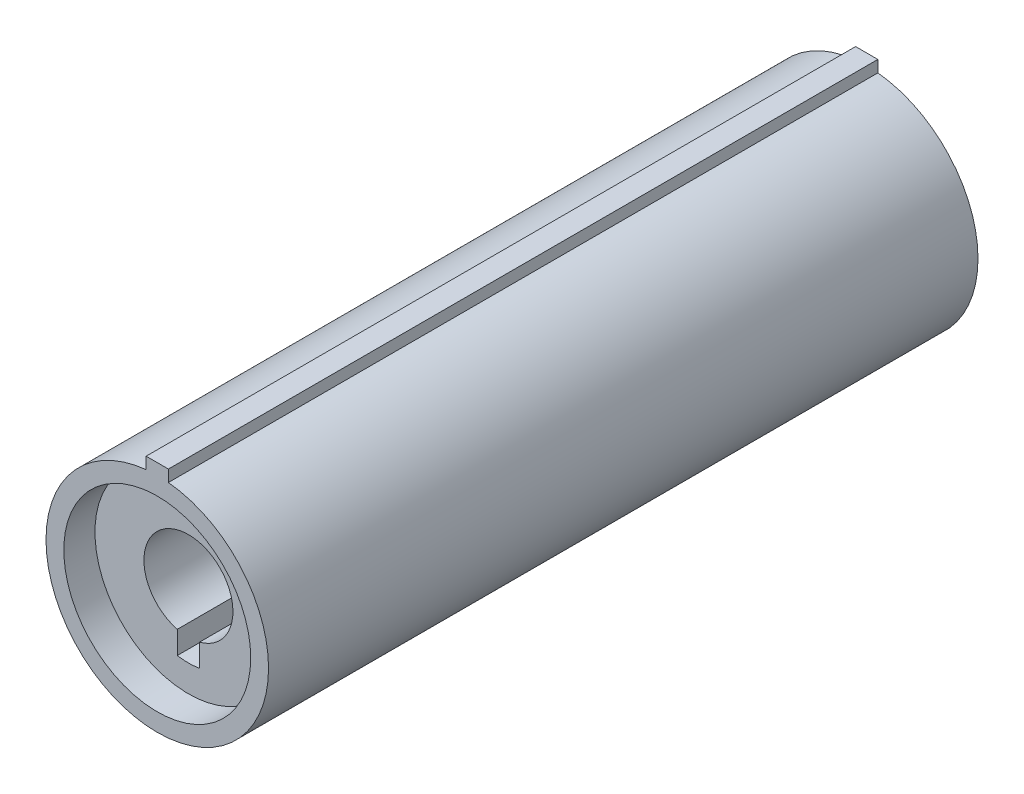
ISO-10303-21;
HEADER;
FILE_DESCRIPTION(('STEP AP214'),'2;1');
FILE_NAME('part.step','',(''),(''),'','','');
FILE_SCHEMA(('AUTOMOTIVE_DESIGN { 1 0 10303 214 1 1 1 1 }'));
ENDSEC;
DATA;
#1=APPLICATION_CONTEXT('core data for automotive mechanical design processes');
#2=APPLICATION_PROTOCOL_DEFINITION('international standard','automotive_design',2000,#1);
#3=PRODUCT_CONTEXT('',#1,'mechanical');
#4=PRODUCT('Part','Part','',(#3));
#5=PRODUCT_RELATED_PRODUCT_CATEGORY('part','',(#4));
#6=PRODUCT_DEFINITION_FORMATION('','',#4);
#7=PRODUCT_DEFINITION_CONTEXT('part definition',#1,'design');
#8=PRODUCT_DEFINITION('design','',#6,#7);
#9=PRODUCT_DEFINITION_SHAPE('','',#8);
#10=(LENGTH_UNIT() NAMED_UNIT(*) SI_UNIT(.MILLI.,.METRE.));
#11=(NAMED_UNIT(*) PLANE_ANGLE_UNIT() SI_UNIT($,.RADIAN.));
#12=(NAMED_UNIT(*) SI_UNIT($,.STERADIAN.) SOLID_ANGLE_UNIT());
#13=UNCERTAINTY_MEASURE_WITH_UNIT(LENGTH_MEASURE(1.E-05),#10,'distance_accuracy_value','');
#14=(GEOMETRIC_REPRESENTATION_CONTEXT(3) GLOBAL_UNCERTAINTY_ASSIGNED_CONTEXT((#13)) GLOBAL_UNIT_ASSIGNED_CONTEXT((#10,
#11,#12)) REPRESENTATION_CONTEXT('',''));
#15=CARTESIAN_POINT('',(0.,0.,0.));
#16=DIRECTION('',(0.,0.,1.));
#17=DIRECTION('',(1.,0.,0.));
#18=AXIS2_PLACEMENT_3D('',#15,#16,#17);
#19=CARTESIAN_POINT('',(0.,0.,152.4));
#20=DIRECTION('',(0.,0.,1.));
#21=DIRECTION('',(1.,0.,0.));
#22=AXIS2_PLACEMENT_3D('',#19,#20,#21);
#23=PLANE('',#22);
#24=DIRECTION('',(0.,-1.,0.));
#25=VECTOR('',#24,1.);
#26=CARTESIAN_POINT('',(2.5,0.,152.4));
#27=LINE('',#26,#25);
#28=CARTESIAN_POINT('',(2.5,-9.68245836551854,152.4));
#29=VERTEX_POINT('',#28);
#30=CARTESIAN_POINT('',(2.5,-14.790199457749,152.4));
#31=VERTEX_POINT('',#30);
#32=EDGE_CURVE('E155',#29,#31,#27,.T.);
#33=ORIENTED_EDGE('',*,*,#32,.T.);
#34=CARTESIAN_POINT('',(0.,0.,152.4));
#35=DIRECTION('',(0.,0.,-1.));
#36=DIRECTION('',(1.,0.,0.));
#37=AXIS2_PLACEMENT_3D('',#34,#35,#36);
#38=CIRCLE('',#37,15.);
#39=CARTESIAN_POINT('',(-2.5,-14.790199457749,152.4));
#40=VERTEX_POINT('',#39);
#41=EDGE_CURVE('E231',#31,#40,#38,.T.);
#42=ORIENTED_EDGE('',*,*,#41,.T.);
#43=DIRECTION('',(0.,-1.,0.));
#44=VECTOR('',#43,1.);
#45=CARTESIAN_POINT('',(-2.5,0.,152.4));
#46=LINE('',#45,#44);
#47=CARTESIAN_POINT('',(-2.5,-9.68245836551854,152.4));
#48=VERTEX_POINT('',#47);
#49=EDGE_CURVE('E68',#48,#40,#46,.T.);
#50=ORIENTED_EDGE('',*,*,#49,.F.);
#51=CARTESIAN_POINT('',(0.,0.,152.4));
#52=DIRECTION('',(0.,0.,1.));
#53=DIRECTION('',(1.,0.,0.));
#54=AXIS2_PLACEMENT_3D('',#51,#52,#53);
#55=CIRCLE('',#54,10.);
#56=EDGE_CURVE('E146',#29,#48,#55,.T.);
#57=ORIENTED_EDGE('',*,*,#56,.F.);
#58=EDGE_LOOP('',(#33,#42,#50,#57));
#59=FACE_BOUND('',#58,.T.);
#60=CARTESIAN_POINT('',(0.,0.,152.4));
#61=DIRECTION('',(0.,0.,1.));
#62=DIRECTION('',(1.,0.,0.));
#63=AXIS2_PLACEMENT_3D('',#60,#61,#62);
#64=CIRCLE('',#63,21.);
#65=CARTESIAN_POINT('',(21.,0.,152.4));
#66=VERTEX_POINT('',#65);
#67=EDGE_CURVE('E11',#66,#66,#64,.T.);
#68=ORIENTED_EDGE('',*,*,#67,.T.);
#69=EDGE_LOOP('',(#68));
#70=FACE_BOUND('',#69,.T.);
#71=ADVANCED_FACE('F44',(#59,#70),#23,.T.);
#72=CARTESIAN_POINT('',(0.,0.,152.4));
#73=DIRECTION('',(0.,0.,-1.));
#74=DIRECTION('',(-1.,0.,0.));
#75=AXIS2_PLACEMENT_3D('',#72,#73,#74);
#76=CYLINDRICAL_SURFACE('',#75,10.);
#77=CARTESIAN_POINT('',(0.,0.,0.));
#78=DIRECTION('',(0.,0.,1.));
#79=DIRECTION('',(1.,0.,0.));
#80=AXIS2_PLACEMENT_3D('',#77,#78,#79);
#81=CIRCLE('',#80,10.);
#82=CARTESIAN_POINT('',(2.5,-9.68245836551854,0.));
#83=VERTEX_POINT('',#82);
#84=CARTESIAN_POINT('',(-2.5,-9.68245836551854,0.));
#85=VERTEX_POINT('',#84);
#86=EDGE_CURVE('E150',#83,#85,#81,.T.);
#87=ORIENTED_EDGE('',*,*,#86,.F.);
#88=DIRECTION('',(0.,0.,-1.));
#89=VECTOR('',#88,1.);
#90=CARTESIAN_POINT('',(2.5,-9.68245836551854,152.4));
#91=LINE('',#90,#89);
#92=EDGE_CURVE('E47',#29,#83,#91,.T.);
#93=ORIENTED_EDGE('',*,*,#92,.F.);
#94=ORIENTED_EDGE('',*,*,#56,.T.);
#95=DIRECTION('',(0.,0.,-1.));
#96=VECTOR('',#95,1.);
#97=CARTESIAN_POINT('',(-2.5,-9.68245836551854,152.4));
#98=LINE('',#97,#96);
#99=EDGE_CURVE('E158',#48,#85,#98,.T.);
#100=ORIENTED_EDGE('',*,*,#99,.T.);
#101=EDGE_LOOP('',(#87,#93,#94,#100));
#102=FACE_BOUND('',#101,.T.);
#103=ADVANCED_FACE('F50',(#102),#76,.F.);
#104=CARTESIAN_POINT('',(2.5,0.,152.4));
#105=DIRECTION('',(1.,0.,0.));
#106=DIRECTION('',(0.,1.,0.));
#107=AXIS2_PLACEMENT_3D('',#104,#105,#106);
#108=PLANE('',#107);
#109=DIRECTION('',(0.,-1.,0.));
#110=VECTOR('',#109,1.);
#111=CARTESIAN_POINT('',(2.5,0.,0.));
#112=LINE('',#111,#110);
#113=CARTESIAN_POINT('',(2.5,-14.790199457749,0.));
#114=VERTEX_POINT('',#113);
#115=EDGE_CURVE('E165',#83,#114,#112,.T.);
#116=ORIENTED_EDGE('',*,*,#115,.T.);
#117=DIRECTION('',(0.,0.,1.));
#118=VECTOR('',#117,1.);
#119=CARTESIAN_POINT('',(2.5,-14.790199457749,-11.3683783853524));
#120=LINE('',#119,#118);
#121=EDGE_CURVE('E64',#114,#31,#120,.T.);
#122=ORIENTED_EDGE('',*,*,#121,.T.);
#123=ORIENTED_EDGE('',*,*,#32,.F.);
#124=ORIENTED_EDGE('',*,*,#92,.T.);
#125=EDGE_LOOP('',(#116,#122,#123,#124));
#126=FACE_BOUND('',#125,.T.);
#127=ADVANCED_FACE('F216',(#126),#108,.F.);
#128=CARTESIAN_POINT('',(2.5,0.,152.4));
#129=DIRECTION('',(1.,0.,0.));
#130=DIRECTION('',(0.,1.,0.));
#131=AXIS2_PLACEMENT_3D('',#128,#129,#130);
#132=PLANE('',#131);
#133=DIRECTION('',(0.,-1.,0.));
#134=VECTOR('',#133,1.);
#135=CARTESIAN_POINT('',(2.5,0.,0.));
#136=LINE('',#135,#134);
#137=CARTESIAN_POINT('',(2.5,27.5,0.));
#138=VERTEX_POINT('',#137);
#139=CARTESIAN_POINT('',(2.5,24.8746859276655,0.));
#140=VERTEX_POINT('',#139);
#141=EDGE_CURVE('E164',#138,#140,#136,.T.);
#142=ORIENTED_EDGE('',*,*,#141,.F.);
#143=DIRECTION('',(0.,0.,-1.));
#144=VECTOR('',#143,1.);
#145=CARTESIAN_POINT('',(2.5,27.5,152.4));
#146=LINE('',#145,#144);
#147=CARTESIAN_POINT('',(2.5,27.5,159.4));
#148=VERTEX_POINT('',#147);
#149=EDGE_CURVE('E121',#148,#138,#146,.T.);
#150=ORIENTED_EDGE('',*,*,#149,.F.);
#151=DIRECTION('',(0.,1.,0.));
#152=VECTOR('',#151,1.);
#153=CARTESIAN_POINT('',(2.5,27.5,159.4));
#154=LINE('',#153,#152);
#155=CARTESIAN_POINT('',(2.5,24.8746859276655,159.4));
#156=VERTEX_POINT('',#155);
#157=EDGE_CURVE('E132',#156,#148,#154,.T.);
#158=ORIENTED_EDGE('',*,*,#157,.F.);
#159=DIRECTION('',(0.,0.,-1.));
#160=VECTOR('',#159,1.);
#161=CARTESIAN_POINT('',(2.5,24.8746859276655,152.4));
#162=LINE('',#161,#160);
#163=EDGE_CURVE('E114',#156,#140,#162,.T.);
#164=ORIENTED_EDGE('',*,*,#163,.T.);
#165=EDGE_LOOP('',(#142,#150,#158,#164));
#166=FACE_BOUND('',#165,.T.);
#167=ADVANCED_FACE('F140',(#166),#132,.T.);
#168=CARTESIAN_POINT('',(0.,27.5,152.4));
#169=DIRECTION('',(0.,1.,0.));
#170=DIRECTION('',(0.,0.,1.));
#171=AXIS2_PLACEMENT_3D('',#168,#169,#170);
#172=PLANE('',#171);
#173=DIRECTION('',(1.,0.,0.));
#174=VECTOR('',#173,1.);
#175=CARTESIAN_POINT('',(0.,27.5,0.));
#176=LINE('',#175,#174);
#177=CARTESIAN_POINT('',(-2.5,27.5,0.));
#178=VERTEX_POINT('',#177);
#179=EDGE_CURVE('E172',#178,#138,#176,.T.);
#180=ORIENTED_EDGE('',*,*,#179,.F.);
#181=DIRECTION('',(0.,0.,-1.));
#182=VECTOR('',#181,1.);
#183=CARTESIAN_POINT('',(-2.5,27.5,152.4));
#184=LINE('',#183,#182);
#185=CARTESIAN_POINT('',(-2.5,27.5,159.4));
#186=VERTEX_POINT('',#185);
#187=EDGE_CURVE('E187',#186,#178,#184,.T.);
#188=ORIENTED_EDGE('',*,*,#187,.F.);
#189=DIRECTION('',(-1.,0.,0.));
#190=VECTOR('',#189,1.);
#191=CARTESIAN_POINT('',(-2.5,27.5,159.4));
#192=LINE('',#191,#190);
#193=EDGE_CURVE('E138',#148,#186,#192,.T.);
#194=ORIENTED_EDGE('',*,*,#193,.F.);
#195=ORIENTED_EDGE('',*,*,#149,.T.);
#196=EDGE_LOOP('',(#180,#188,#194,#195));
#197=FACE_BOUND('',#196,.T.);
#198=ADVANCED_FACE('F194',(#197),#172,.T.);
#199=CARTESIAN_POINT('',(-2.5,0.,152.4));
#200=DIRECTION('',(-1.,0.,0.));
#201=DIRECTION('',(0.,-1.,0.));
#202=AXIS2_PLACEMENT_3D('',#199,#200,#201);
#203=PLANE('',#202);
#204=DIRECTION('',(0.,1.,0.));
#205=VECTOR('',#204,1.);
#206=CARTESIAN_POINT('',(-2.5,0.,0.));
#207=LINE('',#206,#205);
#208=CARTESIAN_POINT('',(-2.5,24.8746859276655,0.));
#209=VERTEX_POINT('',#208);
#210=EDGE_CURVE('E169',#209,#178,#207,.T.);
#211=ORIENTED_EDGE('',*,*,#210,.F.);
#212=DIRECTION('',(0.,0.,-1.));
#213=VECTOR('',#212,1.);
#214=CARTESIAN_POINT('',(-2.5,24.8746859276655,152.4));
#215=LINE('',#214,#213);
#216=CARTESIAN_POINT('',(-2.5,24.8746859276655,159.4));
#217=VERTEX_POINT('',#216);
#218=EDGE_CURVE('E181',#217,#209,#215,.T.);
#219=ORIENTED_EDGE('',*,*,#218,.F.);
#220=DIRECTION('',(0.,-1.,0.));
#221=VECTOR('',#220,1.);
#222=CARTESIAN_POINT('',(-2.5,27.5,159.4));
#223=LINE('',#222,#221);
#224=EDGE_CURVE('E131',#186,#217,#223,.T.);
#225=ORIENTED_EDGE('',*,*,#224,.F.);
#226=ORIENTED_EDGE('',*,*,#187,.T.);
#227=EDGE_LOOP('',(#211,#219,#225,#226));
#228=FACE_BOUND('',#227,.T.);
#229=ADVANCED_FACE('F196',(#228),#203,.T.);
#230=CARTESIAN_POINT('',(0.,0.,152.4));
#231=DIRECTION('',(0.,0.,-1.));
#232=DIRECTION('',(-1.,0.,0.));
#233=AXIS2_PLACEMENT_3D('',#230,#231,#232);
#234=CYLINDRICAL_SURFACE('',#233,25.);
#235=CARTESIAN_POINT('',(0.,0.,0.));
#236=DIRECTION('',(0.,0.,1.));
#237=DIRECTION('',(1.,0.,0.));
#238=AXIS2_PLACEMENT_3D('',#235,#236,#237);
#239=CIRCLE('',#238,25.);
#240=EDGE_CURVE('E120',#209,#140,#239,.T.);
#241=ORIENTED_EDGE('',*,*,#240,.T.);
#242=ORIENTED_EDGE('',*,*,#163,.F.);
#243=CARTESIAN_POINT('',(0.,0.,159.4));
#244=DIRECTION('',(0.,0.,1.));
#245=DIRECTION('',(1.,0.,0.));
#246=AXIS2_PLACEMENT_3D('',#243,#244,#245);
#247=CIRCLE('',#246,25.);
#248=EDGE_CURVE('E117',#217,#156,#247,.T.);
#249=ORIENTED_EDGE('',*,*,#248,.F.);
#250=ORIENTED_EDGE('',*,*,#218,.T.);
#251=EDGE_LOOP('',(#241,#242,#249,#250));
#252=FACE_BOUND('',#251,.T.);
#253=ADVANCED_FACE('F113',(#252),#234,.T.);
#254=CARTESIAN_POINT('',(-2.5,0.,152.4));
#255=DIRECTION('',(1.,0.,0.));
#256=DIRECTION('',(0.,1.,0.));
#257=AXIS2_PLACEMENT_3D('',#254,#255,#256);
#258=PLANE('',#257);
#259=DIRECTION('',(0.,0.,1.));
#260=VECTOR('',#259,1.);
#261=CARTESIAN_POINT('',(-2.5,-14.790199457749,-11.3683783853524));
#262=LINE('',#261,#260);
#263=CARTESIAN_POINT('',(-2.5,-14.790199457749,0.));
#264=VERTEX_POINT('',#263);
#265=EDGE_CURVE('E230',#264,#40,#262,.T.);
#266=ORIENTED_EDGE('',*,*,#265,.F.);
#267=DIRECTION('',(0.,-1.,0.));
#268=VECTOR('',#267,1.);
#269=CARTESIAN_POINT('',(-2.5,0.,0.));
#270=LINE('',#269,#268);
#271=EDGE_CURVE('E153',#85,#264,#270,.T.);
#272=ORIENTED_EDGE('',*,*,#271,.F.);
#273=ORIENTED_EDGE('',*,*,#99,.F.);
#274=ORIENTED_EDGE('',*,*,#49,.T.);
#275=EDGE_LOOP('',(#266,#272,#273,#274));
#276=FACE_BOUND('',#275,.T.);
#277=ADVANCED_FACE('F206',(#276),#258,.T.);
#278=CARTESIAN_POINT('',(0.,0.,0.));
#279=DIRECTION('',(0.,0.,1.));
#280=DIRECTION('',(1.,0.,0.));
#281=AXIS2_PLACEMENT_3D('',#278,#279,#280);
#282=PLANE('',#281);
#283=ORIENTED_EDGE('',*,*,#141,.T.);
#284=ORIENTED_EDGE('',*,*,#240,.F.);
#285=ORIENTED_EDGE('',*,*,#210,.T.);
#286=ORIENTED_EDGE('',*,*,#179,.T.);
#287=EDGE_LOOP('',(#283,#284,#285,#286));
#288=FACE_BOUND('',#287,.T.);
#289=ORIENTED_EDGE('',*,*,#86,.T.);
#290=ORIENTED_EDGE('',*,*,#271,.T.);
#291=CARTESIAN_POINT('',(0.,0.,0.));
#292=DIRECTION('',(0.,0.,1.));
#293=DIRECTION('',(1.,0.,0.));
#294=AXIS2_PLACEMENT_3D('',#291,#292,#293);
#295=CIRCLE('',#294,15.);
#296=EDGE_CURVE('E236',#264,#114,#295,.T.);
#297=ORIENTED_EDGE('',*,*,#296,.T.);
#298=ORIENTED_EDGE('',*,*,#115,.F.);
#299=EDGE_LOOP('',(#289,#290,#297,#298));
#300=FACE_BOUND('',#299,.T.);
#301=ADVANCED_FACE('F191',(#288,#300),#282,.F.);
#302=CARTESIAN_POINT('',(0.,0.,159.4));
#303=DIRECTION('',(0.,0.,1.));
#304=DIRECTION('',(1.,0.,0.));
#305=AXIS2_PLACEMENT_3D('',#302,#303,#304);
#306=PLANE('',#305);
#307=ORIENTED_EDGE('',*,*,#248,.T.);
#308=ORIENTED_EDGE('',*,*,#157,.T.);
#309=ORIENTED_EDGE('',*,*,#193,.T.);
#310=ORIENTED_EDGE('',*,*,#224,.T.);
#311=EDGE_LOOP('',(#307,#308,#309,#310));
#312=FACE_BOUND('',#311,.T.);
#313=CARTESIAN_POINT('',(0.,0.,159.4));
#314=DIRECTION('',(0.,0.,1.));
#315=DIRECTION('',(1.,0.,0.));
#316=AXIS2_PLACEMENT_3D('',#313,#314,#315);
#317=CIRCLE('',#316,21.);
#318=CARTESIAN_POINT('',(21.,0.,159.4));
#319=VERTEX_POINT('',#318);
#320=EDGE_CURVE('E137',#319,#319,#317,.T.);
#321=ORIENTED_EDGE('',*,*,#320,.F.);
#322=EDGE_LOOP('',(#321));
#323=FACE_BOUND('',#322,.T.);
#324=ADVANCED_FACE('F126',(#312,#323),#306,.T.);
#325=CARTESIAN_POINT('',(0.,0.,159.4));
#326=DIRECTION('',(0.,0.,-1.));
#327=DIRECTION('',(-1.,0.,0.));
#328=AXIS2_PLACEMENT_3D('',#325,#326,#327);
#329=CYLINDRICAL_SURFACE('',#328,21.);
#330=ORIENTED_EDGE('',*,*,#320,.T.);
#331=EDGE_LOOP('',(#330));
#332=FACE_BOUND('',#331,.T.);
#333=ORIENTED_EDGE('',*,*,#67,.F.);
#334=EDGE_LOOP('',(#333));
#335=FACE_BOUND('',#334,.T.);
#336=ADVANCED_FACE('F299',(#332,#335),#329,.F.);
#337=CARTESIAN_POINT('',(0.,0.,-11.3683783853524));
#338=DIRECTION('',(0.,0.,1.));
#339=DIRECTION('',(1.,0.,0.));
#340=AXIS2_PLACEMENT_3D('',#337,#338,#339);
#341=CYLINDRICAL_SURFACE('',#340,15.);
#342=ORIENTED_EDGE('',*,*,#296,.F.);
#343=ORIENTED_EDGE('',*,*,#265,.T.);
#344=ORIENTED_EDGE('',*,*,#41,.F.);
#345=ORIENTED_EDGE('',*,*,#121,.F.);
#346=EDGE_LOOP('',(#342,#343,#344,#345));
#347=FACE_BOUND('',#346,.T.);
#348=ADVANCED_FACE('F238',(#347),#341,.F.);
#349=CLOSED_SHELL('',(#71,#103,#127,#167,#198,#229,#253,#277,#301,#324,#336,#348));
#350=MANIFOLD_SOLID_BREP('B2',#349);
#351=ADVANCED_BREP_SHAPE_REPRESENTATION('',(#18,#350),#14);
#352=SHAPE_DEFINITION_REPRESENTATION(#9,#351);
ENDSEC;
END-ISO-10303-21;
